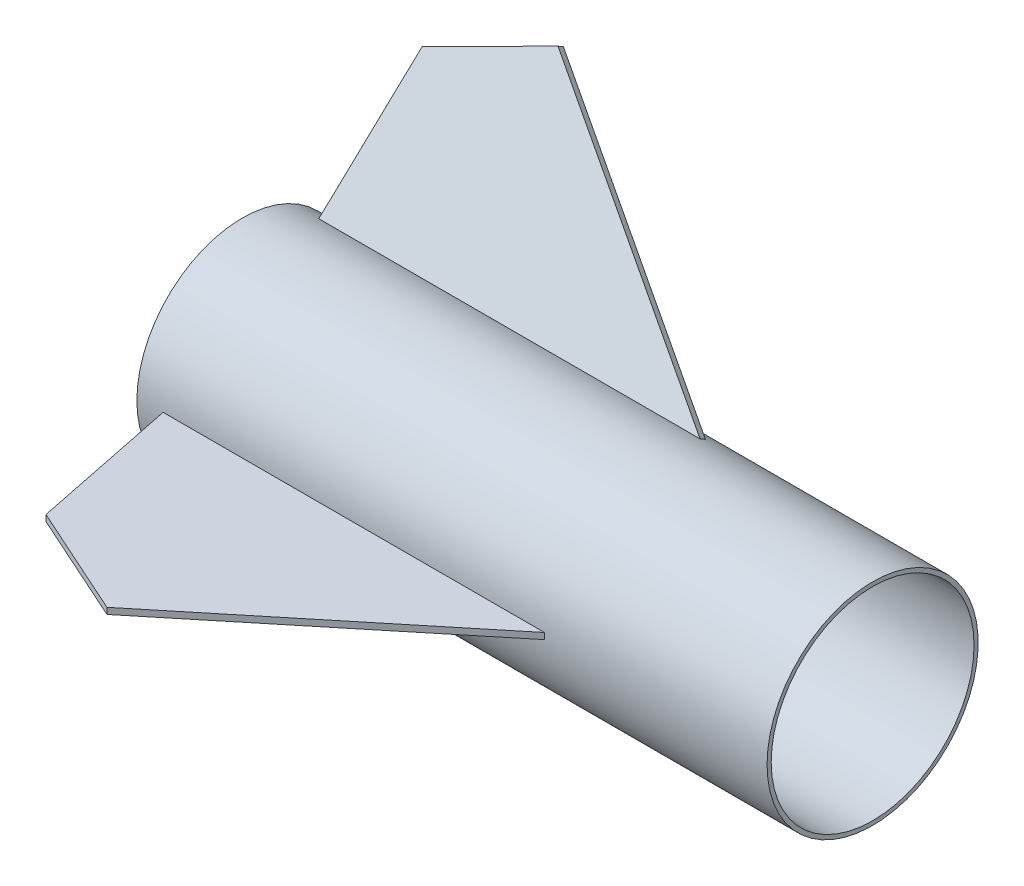
ISO-10303-21;
HEADER;
FILE_DESCRIPTION(('STEP AP214'),'2;1');
FILE_NAME('part.step','',(''),(''),'','','');
FILE_SCHEMA(('AUTOMOTIVE_DESIGN { 1 0 10303 214 1 1 1 1 }'));
ENDSEC;
DATA;
#1=APPLICATION_CONTEXT('core data for automotive mechanical design processes');
#2=APPLICATION_PROTOCOL_DEFINITION('international standard','automotive_design',2000,#1);
#3=PRODUCT_CONTEXT('',#1,'mechanical');
#4=PRODUCT('Part','Part','',(#3));
#5=PRODUCT_RELATED_PRODUCT_CATEGORY('part','',(#4));
#6=PRODUCT_DEFINITION_FORMATION('','',#4);
#7=PRODUCT_DEFINITION_CONTEXT('part definition',#1,'design');
#8=PRODUCT_DEFINITION('design','',#6,#7);
#9=PRODUCT_DEFINITION_SHAPE('','',#8);
#10=(LENGTH_UNIT() NAMED_UNIT(*) SI_UNIT(.MILLI.,.METRE.));
#11=(NAMED_UNIT(*) PLANE_ANGLE_UNIT() SI_UNIT($,.RADIAN.));
#12=(NAMED_UNIT(*) SI_UNIT($,.STERADIAN.) SOLID_ANGLE_UNIT());
#13=UNCERTAINTY_MEASURE_WITH_UNIT(LENGTH_MEASURE(1.E-05),#10,'distance_accuracy_value','');
#14=(GEOMETRIC_REPRESENTATION_CONTEXT(3) GLOBAL_UNCERTAINTY_ASSIGNED_CONTEXT((#13)) GLOBAL_UNIT_ASSIGNED_CONTEXT((#10,
#11,#12)) REPRESENTATION_CONTEXT('',''));
#15=CARTESIAN_POINT('',(0.,0.,0.));
#16=DIRECTION('',(0.,0.,1.));
#17=DIRECTION('',(1.,0.,0.));
#18=AXIS2_PLACEMENT_3D('',#15,#16,#17);
#19=CARTESIAN_POINT('',(27.1780000000002,-105.055787681961,-62.3860381056757));
#20=DIRECTION('',(-0.979901892234314,-0.172754771849313,-0.0997400140309911));
#21=DIRECTION('',(0.199480028061985,-0.848619931891362,-0.489950946117149));
#22=AXIS2_PLACEMENT_3D('',#19,#20,#21);
#23=PLANE('',#22);
#24=DIRECTION('',(0.,-0.499999999999992,0.866025403784443));
#25=VECTOR('',#24,1.);
#26=CARTESIAN_POINT('',(27.1780000000002,-105.055787681961,-62.3860381056757));
#27=LINE('',#26,#25);
#28=CARTESIAN_POINT('',(27.1780000000002,-105.055787681961,-62.3860381056757));
#29=VERTEX_POINT('',#28);
#30=CARTESIAN_POINT('',(27.1780000000002,-106.555787681961,-59.7879618943223));
#31=VERTEX_POINT('',#30);
#32=EDGE_CURVE('E53',#29,#31,#27,.T.);
#33=ORIENTED_EDGE('',*,*,#32,.T.);
#34=DIRECTION('',(0.199480028061985,-0.848619931891362,-0.489950946117149));
#35=VECTOR('',#34,1.);
#36=CARTESIAN_POINT('',(27.1780000000002,-106.555787681961,-59.7879618943223));
#37=LINE('',#36,#35);
#38=CARTESIAN_POINT('',(12.7000000000002,-44.9640609648109,-24.2279618943229));
#39=VERTEX_POINT('',#38);
#40=EDGE_CURVE('E90',#39,#31,#37,.T.);
#41=ORIENTED_EDGE('',*,*,#40,.F.);
#42=DIRECTION('',(0.,-0.499999999999992,0.866025403784443));
#43=VECTOR('',#42,1.);
#44=CARTESIAN_POINT('',(12.7000000000002,-43.464060964811,-26.8260381056763));
#45=LINE('',#44,#43);
#46=CARTESIAN_POINT('',(12.7000000000002,-43.464060964811,-26.8260381056763));
#47=VERTEX_POINT('',#46);
#48=EDGE_CURVE('E12',#47,#39,#45,.T.);
#49=ORIENTED_EDGE('',*,*,#48,.F.);
#50=DIRECTION('',(0.199480028061985,-0.848619931891362,-0.489950946117149));
#51=VECTOR('',#50,1.);
#52=CARTESIAN_POINT('',(27.1780000000002,-105.055787681961,-62.3860381056757));
#53=LINE('',#52,#51);
#54=EDGE_CURVE('E91',#47,#29,#53,.T.);
#55=ORIENTED_EDGE('',*,*,#54,.T.);
#56=EDGE_LOOP('',(#33,#41,#49,#55));
#57=FACE_BOUND('',#56,.T.);
#58=ADVANCED_FACE('F50',(#57),#23,.T.);
#59=CARTESIAN_POINT('',(12.7000000000002,-43.464060964811,-26.8260381056763));
#60=DIRECTION('',(0.,0.866025403784443,0.499999999999992));
#61=DIRECTION('',(-1.,0.,0.));
#62=AXIS2_PLACEMENT_3D('',#59,#60,#61);
#63=PLANE('',#62);
#64=ORIENTED_EDGE('',*,*,#48,.T.);
#65=DIRECTION('',(-1.,0.,0.));
#66=VECTOR('',#65,1.);
#67=CARTESIAN_POINT('',(12.7000000000002,-44.9640609648109,-24.2279618943229));
#68=LINE('',#67,#66);
#69=CARTESIAN_POINT('',(197.104,-44.9640609648109,-24.2279618943229));
#70=VERTEX_POINT('',#69);
#71=EDGE_CURVE('E107',#70,#39,#68,.T.);
#72=ORIENTED_EDGE('',*,*,#71,.F.);
#73=DIRECTION('',(0.,-0.499999999999992,0.866025403784443));
#74=VECTOR('',#73,1.);
#75=CARTESIAN_POINT('',(197.104,-43.464060964811,-26.8260381056762));
#76=LINE('',#75,#74);
#77=CARTESIAN_POINT('',(197.104,-43.464060964811,-26.8260381056762));
#78=VERTEX_POINT('',#77);
#79=EDGE_CURVE('E58',#78,#70,#76,.T.);
#80=ORIENTED_EDGE('',*,*,#79,.F.);
#81=DIRECTION('',(-1.,0.,0.));
#82=VECTOR('',#81,1.);
#83=CARTESIAN_POINT('',(12.7000000000002,-43.464060964811,-26.8260381056763));
#84=LINE('',#83,#82);
#85=EDGE_CURVE('E96',#78,#47,#84,.T.);
#86=ORIENTED_EDGE('',*,*,#85,.T.);
#87=EDGE_LOOP('',(#64,#72,#80,#86));
#88=FACE_BOUND('',#87,.T.);
#89=ADVANCED_FACE('F122',(#88),#63,.T.);
#90=CARTESIAN_POINT('',(197.104,-43.464060964811,-26.8260381056762));
#91=DIRECTION('',(0.633513736179013,-0.67007108544869,-0.386865721559978));
#92=DIRECTION('',(0.773731443119968,0.548638989177421,0.316756868089502));
#93=AXIS2_PLACEMENT_3D('',#90,#91,#92);
#94=PLANE('',#93);
#95=ORIENTED_EDGE('',*,*,#79,.T.);
#96=DIRECTION('',(0.773731443119968,0.548638989177421,0.316756868089501));
#97=VECTOR('',#96,1.);
#98=CARTESIAN_POINT('',(197.104,-44.9640609648109,-24.2279618943229));
#99=LINE('',#98,#97);
#100=CARTESIAN_POINT('',(80.7720000000002,-127.452980675279,-71.8529618943222));
#101=VERTEX_POINT('',#100);
#102=EDGE_CURVE('E103',#101,#70,#99,.T.);
#103=ORIENTED_EDGE('',*,*,#102,.F.);
#104=DIRECTION('',(0.,-0.499999999999992,0.866025403784443));
#105=VECTOR('',#104,1.);
#106=CARTESIAN_POINT('',(80.7720000000002,-125.952980675279,-74.4510381056755));
#107=LINE('',#106,#105);
#108=CARTESIAN_POINT('',(80.7720000000002,-125.952980675279,-74.4510381056755));
#109=VERTEX_POINT('',#108);
#110=EDGE_CURVE('E95',#109,#101,#107,.T.);
#111=ORIENTED_EDGE('',*,*,#110,.F.);
#112=DIRECTION('',(0.773731443119968,0.548638989177421,0.316756868089501));
#113=VECTOR('',#112,1.);
#114=CARTESIAN_POINT('',(197.104,-43.464060964811,-26.8260381056762));
#115=LINE('',#114,#113);
#116=EDGE_CURVE('E115',#109,#78,#115,.T.);
#117=ORIENTED_EDGE('',*,*,#116,.T.);
#118=EDGE_LOOP('',(#95,#103,#111,#117));
#119=FACE_BOUND('',#118,.T.);
#120=ADVANCED_FACE('F119',(#119),#94,.T.);
#121=CARTESIAN_POINT('',(80.7720000000002,-125.952980675279,-74.4510381056755));
#122=DIRECTION('',(-0.410544358325341,-0.78967714756439,-0.455920313719187));
#123=DIRECTION('',(0.911840627438388,-0.355541843690129,-0.205272179162667));
#124=AXIS2_PLACEMENT_3D('',#121,#122,#123);
#125=PLANE('',#124);
#126=ORIENTED_EDGE('',*,*,#110,.T.);
#127=DIRECTION('',(0.911840627438388,-0.355541843690129,-0.205272179162667));
#128=VECTOR('',#127,1.);
#129=CARTESIAN_POINT('',(80.7720000000002,-127.452980675279,-71.8529618943222));
#130=LINE('',#129,#128);
#131=EDGE_CURVE('E98',#31,#101,#130,.T.);
#132=ORIENTED_EDGE('',*,*,#131,.F.);
#133=ORIENTED_EDGE('',*,*,#32,.F.);
#134=DIRECTION('',(0.911840627438388,-0.355541843690129,-0.205272179162667));
#135=VECTOR('',#134,1.);
#136=CARTESIAN_POINT('',(80.7720000000002,-125.952980675279,-74.4510381056755));
#137=LINE('',#136,#135);
#138=EDGE_CURVE('E113',#29,#109,#137,.T.);
#139=ORIENTED_EDGE('',*,*,#138,.T.);
#140=EDGE_LOOP('',(#126,#132,#133,#139));
#141=FACE_BOUND('',#140,.T.);
#142=ADVANCED_FACE('F99',(#141),#125,.T.);
#143=CARTESIAN_POINT('',(0.,0.749999999999988,-1.29903810567666));
#144=DIRECTION('',(0.,0.499999999999992,-0.866025403784443));
#145=DIRECTION('',(0.,0.866025403784443,0.499999999999992));
#146=AXIS2_PLACEMENT_3D('',#143,#144,#145);
#147=PLANE('',#146);
#148=ORIENTED_EDGE('',*,*,#54,.F.);
#149=ORIENTED_EDGE('',*,*,#85,.F.);
#150=ORIENTED_EDGE('',*,*,#116,.F.);
#151=ORIENTED_EDGE('',*,*,#138,.F.);
#152=EDGE_LOOP('',(#148,#149,#150,#151));
#153=FACE_BOUND('',#152,.T.);
#154=ADVANCED_FACE('F124',(#153),#147,.T.);
#155=CARTESIAN_POINT('',(0.,-0.749999999999988,1.29903810567666));
#156=DIRECTION('',(0.,0.499999999999992,-0.866025403784443));
#157=DIRECTION('',(0.,0.866025403784443,0.499999999999992));
#158=AXIS2_PLACEMENT_3D('',#155,#156,#157);
#159=PLANE('',#158);
#160=ORIENTED_EDGE('',*,*,#40,.T.);
#161=ORIENTED_EDGE('',*,*,#131,.T.);
#162=ORIENTED_EDGE('',*,*,#102,.T.);
#163=ORIENTED_EDGE('',*,*,#71,.T.);
#164=EDGE_LOOP('',(#160,#161,#162,#163));
#165=FACE_BOUND('',#164,.T.);
#166=ADVANCED_FACE('F106',(#165),#159,.F.);
#167=CLOSED_SHELL('',(#58,#89,#120,#142,#154,#166));
#168=MANIFOLD_SOLID_BREP('B2',#167);
#169=CARTESIAN_POINT('',(27.1780000000002,106.55578768196,-59.7879618943238));
#170=DIRECTION('',(-0.979901892234314,0.172754771849312,-0.0997400140309935));
#171=DIRECTION('',(0.199480028061985,0.848619931891355,-0.489950946117161));
#172=AXIS2_PLACEMENT_3D('',#169,#170,#171);
#173=PLANE('',#172);
#174=DIRECTION('',(0.,-0.500000000000004,-0.866025403784436));
#175=VECTOR('',#174,1.);
#176=CARTESIAN_POINT('',(27.1780000000002,106.55578768196,-59.7879618943238));
#177=LINE('',#176,#175);
#178=CARTESIAN_POINT('',(27.1780000000002,106.55578768196,-59.7879618943238));
#179=VERTEX_POINT('',#178);
#180=CARTESIAN_POINT('',(27.1780000000002,105.05578768196,-62.3860381056771));
#181=VERTEX_POINT('',#180);
#182=EDGE_CURVE('E187',#179,#181,#177,.T.);
#183=ORIENTED_EDGE('',*,*,#182,.T.);
#184=DIRECTION('',(0.199480028061985,0.848619931891355,-0.489950946117161));
#185=VECTOR('',#184,1.);
#186=CARTESIAN_POINT('',(27.1780000000002,105.05578768196,-62.3860381056771));
#187=LINE('',#186,#185);
#188=CARTESIAN_POINT('',(12.7000000000002,43.4640609648106,-26.8260381056769));
#189=VERTEX_POINT('',#188);
#190=EDGE_CURVE('E224',#189,#181,#187,.T.);
#191=ORIENTED_EDGE('',*,*,#190,.F.);
#192=DIRECTION('',(0.,-0.500000000000004,-0.866025403784436));
#193=VECTOR('',#192,1.);
#194=CARTESIAN_POINT('',(12.7000000000002,44.9640609648106,-24.2279618943236));
#195=LINE('',#194,#193);
#196=CARTESIAN_POINT('',(12.7000000000002,44.9640609648106,-24.2279618943236));
#197=VERTEX_POINT('',#196);
#198=EDGE_CURVE('E48',#197,#189,#195,.T.);
#199=ORIENTED_EDGE('',*,*,#198,.F.);
#200=DIRECTION('',(0.199480028061985,0.848619931891355,-0.489950946117161));
#201=VECTOR('',#200,1.);
#202=CARTESIAN_POINT('',(27.1780000000002,106.55578768196,-59.7879618943238));
#203=LINE('',#202,#201);
#204=EDGE_CURVE('E225',#197,#179,#203,.T.);
#205=ORIENTED_EDGE('',*,*,#204,.T.);
#206=EDGE_LOOP('',(#183,#191,#199,#205));
#207=FACE_BOUND('',#206,.T.);
#208=ADVANCED_FACE('F184',(#207),#173,.T.);
#209=CARTESIAN_POINT('',(12.7000000000002,44.9640609648106,-24.2279618943236));
#210=DIRECTION('',(0.,-0.866025403784436,0.500000000000004));
#211=DIRECTION('',(-1.,0.,0.));
#212=AXIS2_PLACEMENT_3D('',#209,#210,#211);
#213=PLANE('',#212);
#214=ORIENTED_EDGE('',*,*,#198,.T.);
#215=DIRECTION('',(-1.,0.,0.));
#216=VECTOR('',#215,1.);
#217=CARTESIAN_POINT('',(12.7000000000002,43.4640609648106,-26.8260381056769));
#218=LINE('',#217,#216);
#219=CARTESIAN_POINT('',(197.104,43.4640609648106,-26.8260381056769));
#220=VERTEX_POINT('',#219);
#221=EDGE_CURVE('E241',#220,#189,#218,.T.);
#222=ORIENTED_EDGE('',*,*,#221,.F.);
#223=DIRECTION('',(0.,-0.500000000000004,-0.866025403784436));
#224=VECTOR('',#223,1.);
#225=CARTESIAN_POINT('',(197.104,44.9640609648106,-24.2279618943235));
#226=LINE('',#225,#224);
#227=CARTESIAN_POINT('',(197.104,44.9640609648106,-24.2279618943235));
#228=VERTEX_POINT('',#227);
#229=EDGE_CURVE('E192',#228,#220,#226,.T.);
#230=ORIENTED_EDGE('',*,*,#229,.F.);
#231=DIRECTION('',(-1.,0.,0.));
#232=VECTOR('',#231,1.);
#233=CARTESIAN_POINT('',(12.7000000000002,44.9640609648106,-24.2279618943236));
#234=LINE('',#233,#232);
#235=EDGE_CURVE('E230',#228,#197,#234,.T.);
#236=ORIENTED_EDGE('',*,*,#235,.T.);
#237=EDGE_LOOP('',(#214,#222,#230,#236));
#238=FACE_BOUND('',#237,.T.);
#239=ADVANCED_FACE('F256',(#238),#213,.T.);
#240=CARTESIAN_POINT('',(197.104,44.9640609648106,-24.2279618943235));
#241=DIRECTION('',(0.633513736179013,0.670071085448685,-0.386865721559987));
#242=DIRECTION('',(0.773731443119968,-0.548638989177417,0.316756868089509));
#243=AXIS2_PLACEMENT_3D('',#240,#241,#242);
#244=PLANE('',#243);
#245=ORIENTED_EDGE('',*,*,#229,.T.);
#246=DIRECTION('',(0.773731443119968,-0.548638989177417,0.316756868089509));
#247=VECTOR('',#246,1.);
#248=CARTESIAN_POINT('',(197.104,43.4640609648106,-26.8260381056769));
#249=LINE('',#248,#247);
#250=CARTESIAN_POINT('',(80.7720000000002,125.952980675278,-74.4510381056773));
#251=VERTEX_POINT('',#250);
#252=EDGE_CURVE('E237',#251,#220,#249,.T.);
#253=ORIENTED_EDGE('',*,*,#252,.F.);
#254=DIRECTION('',(0.,-0.500000000000004,-0.866025403784436));
#255=VECTOR('',#254,1.);
#256=CARTESIAN_POINT('',(80.7720000000002,127.452980675278,-71.852961894324));
#257=LINE('',#256,#255);
#258=CARTESIAN_POINT('',(80.7720000000002,127.452980675278,-71.852961894324));
#259=VERTEX_POINT('',#258);
#260=EDGE_CURVE('E229',#259,#251,#257,.T.);
#261=ORIENTED_EDGE('',*,*,#260,.F.);
#262=DIRECTION('',(0.773731443119968,-0.548638989177417,0.316756868089509));
#263=VECTOR('',#262,1.);
#264=CARTESIAN_POINT('',(197.104,44.9640609648106,-24.2279618943235));
#265=LINE('',#264,#263);
#266=EDGE_CURVE('E249',#259,#228,#265,.T.);
#267=ORIENTED_EDGE('',*,*,#266,.T.);
#268=EDGE_LOOP('',(#245,#253,#261,#267));
#269=FACE_BOUND('',#268,.T.);
#270=ADVANCED_FACE('F253',(#269),#244,.T.);
#271=CARTESIAN_POINT('',(80.7720000000002,127.452980675278,-71.852961894324));
#272=DIRECTION('',(-0.410544358325341,0.789677147564384,-0.455920313719198));
#273=DIRECTION('',(0.911840627438388,0.355541843690126,-0.205272179162672));
#274=AXIS2_PLACEMENT_3D('',#271,#272,#273);
#275=PLANE('',#274);
#276=ORIENTED_EDGE('',*,*,#260,.T.);
#277=DIRECTION('',(0.911840627438388,0.355541843690126,-0.205272179162672));
#278=VECTOR('',#277,1.);
#279=CARTESIAN_POINT('',(80.7720000000002,125.952980675278,-74.4510381056773));
#280=LINE('',#279,#278);
#281=EDGE_CURVE('E232',#181,#251,#280,.T.);
#282=ORIENTED_EDGE('',*,*,#281,.F.);
#283=ORIENTED_EDGE('',*,*,#182,.F.);
#284=DIRECTION('',(0.911840627438388,0.355541843690126,-0.205272179162672));
#285=VECTOR('',#284,1.);
#286=CARTESIAN_POINT('',(80.7720000000002,127.452980675278,-71.852961894324));
#287=LINE('',#286,#285);
#288=EDGE_CURVE('E247',#179,#259,#287,.T.);
#289=ORIENTED_EDGE('',*,*,#288,.T.);
#290=EDGE_LOOP('',(#276,#282,#283,#289));
#291=FACE_BOUND('',#290,.T.);
#292=ADVANCED_FACE('F233',(#291),#275,.T.);
#293=CARTESIAN_POINT('',(0.,0.750000000000006,1.29903810567665));
#294=DIRECTION('',(0.,0.500000000000004,0.866025403784436));
#295=DIRECTION('',(0.,-0.866025403784436,0.500000000000004));
#296=AXIS2_PLACEMENT_3D('',#293,#294,#295);
#297=PLANE('',#296);
#298=ORIENTED_EDGE('',*,*,#204,.F.);
#299=ORIENTED_EDGE('',*,*,#235,.F.);
#300=ORIENTED_EDGE('',*,*,#266,.F.);
#301=ORIENTED_EDGE('',*,*,#288,.F.);
#302=EDGE_LOOP('',(#298,#299,#300,#301));
#303=FACE_BOUND('',#302,.T.);
#304=ADVANCED_FACE('F258',(#303),#297,.T.);
#305=CARTESIAN_POINT('',(0.,-0.750000000000006,-1.29903810567665));
#306=DIRECTION('',(0.,0.500000000000004,0.866025403784436));
#307=DIRECTION('',(0.,-0.866025403784436,0.500000000000004));
#308=AXIS2_PLACEMENT_3D('',#305,#306,#307);
#309=PLANE('',#308);
#310=ORIENTED_EDGE('',*,*,#190,.T.);
#311=ORIENTED_EDGE('',*,*,#281,.T.);
#312=ORIENTED_EDGE('',*,*,#252,.T.);
#313=ORIENTED_EDGE('',*,*,#221,.T.);
#314=EDGE_LOOP('',(#310,#311,#312,#313));
#315=FACE_BOUND('',#314,.T.);
#316=ADVANCED_FACE('F240',(#315),#309,.F.);
#317=CLOSED_SHELL('',(#208,#239,#270,#292,#304,#316));
#318=MANIFOLD_SOLID_BREP('B6',#317);
#319=CARTESIAN_POINT('',(27.1780000000002,-1.5,122.174));
#320=DIRECTION('',(-0.979901892234314,0.,0.199480028061985));
#321=DIRECTION('',(0.199480028061985,0.,0.979901892234314));
#322=AXIS2_PLACEMENT_3D('',#319,#320,#321);
#323=PLANE('',#322);
#324=DIRECTION('',(0.,1.,0.));
#325=VECTOR('',#324,1.);
#326=CARTESIAN_POINT('',(27.1780000000002,-1.5,122.174));
#327=LINE('',#326,#325);
#328=CARTESIAN_POINT('',(27.1780000000002,-1.5,122.174));
#329=VERTEX_POINT('',#328);
#330=CARTESIAN_POINT('',(27.1780000000002,1.5,122.174));
#331=VERTEX_POINT('',#330);
#332=EDGE_CURVE('E318',#329,#331,#327,.T.);
#333=ORIENTED_EDGE('',*,*,#332,.T.);
#334=DIRECTION('',(0.199480028061985,0.,0.979901892234314));
#335=VECTOR('',#334,1.);
#336=CARTESIAN_POINT('',(27.1780000000002,1.5,122.174));
#337=LINE('',#336,#335);
#338=CARTESIAN_POINT('',(12.7000000000002,1.5,51.054));
#339=VERTEX_POINT('',#338);
#340=EDGE_CURVE('E355',#339,#331,#337,.T.);
#341=ORIENTED_EDGE('',*,*,#340,.F.);
#342=DIRECTION('',(0.,1.,0.));
#343=VECTOR('',#342,1.);
#344=CARTESIAN_POINT('',(12.7000000000002,-1.5,51.054));
#345=LINE('',#344,#343);
#346=CARTESIAN_POINT('',(12.7000000000002,-1.5,51.054));
#347=VERTEX_POINT('',#346);
#348=EDGE_CURVE('E182',#347,#339,#345,.T.);
#349=ORIENTED_EDGE('',*,*,#348,.F.);
#350=DIRECTION('',(0.199480028061985,0.,0.979901892234314));
#351=VECTOR('',#350,1.);
#352=CARTESIAN_POINT('',(27.1780000000002,-1.5,122.174));
#353=LINE('',#352,#351);
#354=EDGE_CURVE('E356',#347,#329,#353,.T.);
#355=ORIENTED_EDGE('',*,*,#354,.T.);
#356=EDGE_LOOP('',(#333,#341,#349,#355));
#357=FACE_BOUND('',#356,.T.);
#358=ADVANCED_FACE('F315',(#357),#323,.T.);
#359=CARTESIAN_POINT('',(12.7000000000002,-1.5,51.054));
#360=DIRECTION('',(0.,0.,-1.));
#361=DIRECTION('',(-1.,0.,0.));
#362=AXIS2_PLACEMENT_3D('',#359,#360,#361);
#363=PLANE('',#362);
#364=ORIENTED_EDGE('',*,*,#348,.T.);
#365=DIRECTION('',(-1.,0.,0.));
#366=VECTOR('',#365,1.);
#367=CARTESIAN_POINT('',(12.7000000000002,1.5,51.054));
#368=LINE('',#367,#366);
#369=CARTESIAN_POINT('',(197.104,1.5,51.054));
#370=VERTEX_POINT('',#369);
#371=EDGE_CURVE('E372',#370,#339,#368,.T.);
#372=ORIENTED_EDGE('',*,*,#371,.F.);
#373=DIRECTION('',(0.,1.,0.));
#374=VECTOR('',#373,1.);
#375=CARTESIAN_POINT('',(197.104,-1.5,51.054));
#376=LINE('',#375,#374);
#377=CARTESIAN_POINT('',(197.104,-1.5,51.054));
#378=VERTEX_POINT('',#377);
#379=EDGE_CURVE('E323',#378,#370,#376,.T.);
#380=ORIENTED_EDGE('',*,*,#379,.F.);
#381=DIRECTION('',(-1.,0.,0.));
#382=VECTOR('',#381,1.);
#383=CARTESIAN_POINT('',(12.7000000000002,-1.5,51.054));
#384=LINE('',#383,#382);
#385=EDGE_CURVE('E361',#378,#347,#384,.T.);
#386=ORIENTED_EDGE('',*,*,#385,.T.);
#387=EDGE_LOOP('',(#364,#372,#380,#386));
#388=FACE_BOUND('',#387,.T.);
#389=ADVANCED_FACE('F387',(#388),#363,.T.);
#390=CARTESIAN_POINT('',(197.104,-1.5,51.054));
#391=DIRECTION('',(0.633513736179013,0.,0.773731443119968));
#392=DIRECTION('',(0.773731443119968,0.,-0.633513736179013));
#393=AXIS2_PLACEMENT_3D('',#390,#391,#392);
#394=PLANE('',#393);
#395=ORIENTED_EDGE('',*,*,#379,.T.);
#396=DIRECTION('',(0.773731443119968,0.,-0.633513736179013));
#397=VECTOR('',#396,1.);
#398=CARTESIAN_POINT('',(197.104,1.5,51.054));
#399=LINE('',#398,#397);
#400=CARTESIAN_POINT('',(80.7720000000002,1.5,146.304));
#401=VERTEX_POINT('',#400);
#402=EDGE_CURVE('E368',#401,#370,#399,.T.);
#403=ORIENTED_EDGE('',*,*,#402,.F.);
#404=DIRECTION('',(0.,1.,0.));
#405=VECTOR('',#404,1.);
#406=CARTESIAN_POINT('',(80.7720000000002,-1.5,146.304));
#407=LINE('',#406,#405);
#408=CARTESIAN_POINT('',(80.7720000000002,-1.5,146.304));
#409=VERTEX_POINT('',#408);
#410=EDGE_CURVE('E360',#409,#401,#407,.T.);
#411=ORIENTED_EDGE('',*,*,#410,.F.);
#412=DIRECTION('',(0.773731443119968,0.,-0.633513736179013));
#413=VECTOR('',#412,1.);
#414=CARTESIAN_POINT('',(197.104,-1.5,51.054));
#415=LINE('',#414,#413);
#416=EDGE_CURVE('E380',#409,#378,#415,.T.);
#417=ORIENTED_EDGE('',*,*,#416,.T.);
#418=EDGE_LOOP('',(#395,#403,#411,#417));
#419=FACE_BOUND('',#418,.T.);
#420=ADVANCED_FACE('F384',(#419),#394,.T.);
#421=CARTESIAN_POINT('',(80.7720000000002,-1.5,146.304));
#422=DIRECTION('',(-0.410544358325341,0.,0.911840627438388));
#423=DIRECTION('',(0.911840627438388,0.,0.410544358325341));
#424=AXIS2_PLACEMENT_3D('',#421,#422,#423);
#425=PLANE('',#424);
#426=ORIENTED_EDGE('',*,*,#410,.T.);
#427=DIRECTION('',(0.911840627438388,0.,0.410544358325341));
#428=VECTOR('',#427,1.);
#429=CARTESIAN_POINT('',(80.7720000000002,1.5,146.304));
#430=LINE('',#429,#428);
#431=EDGE_CURVE('E363',#331,#401,#430,.T.);
#432=ORIENTED_EDGE('',*,*,#431,.F.);
#433=ORIENTED_EDGE('',*,*,#332,.F.);
#434=DIRECTION('',(0.911840627438388,0.,0.410544358325341));
#435=VECTOR('',#434,1.);
#436=CARTESIAN_POINT('',(80.7720000000002,-1.5,146.304));
#437=LINE('',#436,#435);
#438=EDGE_CURVE('E378',#329,#409,#437,.T.);
#439=ORIENTED_EDGE('',*,*,#438,.T.);
#440=EDGE_LOOP('',(#426,#432,#433,#439));
#441=FACE_BOUND('',#440,.T.);
#442=ADVANCED_FACE('F364',(#441),#425,.T.);
#443=CARTESIAN_POINT('',(0.,-1.5,0.));
#444=DIRECTION('',(0.,-1.,0.));
#445=DIRECTION('',(0.,0.,-1.));
#446=AXIS2_PLACEMENT_3D('',#443,#444,#445);
#447=PLANE('',#446);
#448=ORIENTED_EDGE('',*,*,#354,.F.);
#449=ORIENTED_EDGE('',*,*,#385,.F.);
#450=ORIENTED_EDGE('',*,*,#416,.F.);
#451=ORIENTED_EDGE('',*,*,#438,.F.);
#452=EDGE_LOOP('',(#448,#449,#450,#451));
#453=FACE_BOUND('',#452,.T.);
#454=ADVANCED_FACE('F389',(#453),#447,.T.);
#455=CARTESIAN_POINT('',(0.,1.5,0.));
#456=DIRECTION('',(0.,-1.,0.));
#457=DIRECTION('',(0.,0.,-1.));
#458=AXIS2_PLACEMENT_3D('',#455,#456,#457);
#459=PLANE('',#458);
#460=ORIENTED_EDGE('',*,*,#340,.T.);
#461=ORIENTED_EDGE('',*,*,#431,.T.);
#462=ORIENTED_EDGE('',*,*,#402,.T.);
#463=ORIENTED_EDGE('',*,*,#371,.T.);
#464=EDGE_LOOP('',(#460,#461,#462,#463));
#465=FACE_BOUND('',#464,.T.);
#466=ADVANCED_FACE('F371',(#465),#459,.F.);
#467=CLOSED_SHELL('',(#358,#389,#420,#442,#454,#466));
#468=MANIFOLD_SOLID_BREP('B42',#467);
#469=CARTESIAN_POINT('',(304.8,0.,0.));
#470=DIRECTION('',(1.,0.,0.));
#471=DIRECTION('',(0.,0.,-1.));
#472=AXIS2_PLACEMENT_3D('',#469,#470,#471);
#473=PLANE('',#472);
#474=CARTESIAN_POINT('',(304.8,0.,0.));
#475=DIRECTION('',(1.,0.,0.));
#476=DIRECTION('',(0.,0.,-1.));
#477=AXIS2_PLACEMENT_3D('',#474,#475,#476);
#478=CIRCLE('',#477,51.054);
#479=CARTESIAN_POINT('',(304.8,0.,51.054));
#480=VERTEX_POINT('',#479);
#481=EDGE_CURVE('E314',#480,#480,#478,.T.);
#482=ORIENTED_EDGE('',*,*,#481,.T.);
#483=EDGE_LOOP('',(#482));
#484=FACE_BOUND('',#483,.T.);
#485=CARTESIAN_POINT('',(304.8,0.,0.));
#486=DIRECTION('',(1.,0.,0.));
#487=DIRECTION('',(0.,0.,-1.));
#488=AXIS2_PLACEMENT_3D('',#485,#486,#487);
#489=CIRCLE('',#488,49.0601);
#490=CARTESIAN_POINT('',(304.8,0.,49.0601));
#491=VERTEX_POINT('',#490);
#492=EDGE_CURVE('E450',#491,#491,#489,.T.);
#493=ORIENTED_EDGE('',*,*,#492,.F.);
#494=EDGE_LOOP('',(#493));
#495=FACE_BOUND('',#494,.T.);
#496=ADVANCED_FACE('F439',(#484,#495),#473,.T.);
#497=CARTESIAN_POINT('',(0.,0.,0.));
#498=DIRECTION('',(1.,0.,0.));
#499=DIRECTION('',(0.,0.,-1.));
#500=AXIS2_PLACEMENT_3D('',#497,#498,#499);
#501=PLANE('',#500);
#502=CARTESIAN_POINT('',(0.,0.,0.));
#503=DIRECTION('',(1.,0.,0.));
#504=DIRECTION('',(0.,0.,-1.));
#505=AXIS2_PLACEMENT_3D('',#502,#503,#504);
#506=CIRCLE('',#505,51.054);
#507=CARTESIAN_POINT('',(0.,0.,51.054));
#508=VERTEX_POINT('',#507);
#509=EDGE_CURVE('E443',#508,#508,#506,.T.);
#510=ORIENTED_EDGE('',*,*,#509,.F.);
#511=EDGE_LOOP('',(#510));
#512=FACE_BOUND('',#511,.T.);
#513=CARTESIAN_POINT('',(0.,0.,0.));
#514=DIRECTION('',(1.,0.,0.));
#515=DIRECTION('',(0.,0.,-1.));
#516=AXIS2_PLACEMENT_3D('',#513,#514,#515);
#517=CIRCLE('',#516,49.0601);
#518=CARTESIAN_POINT('',(0.,0.,49.0601));
#519=VERTEX_POINT('',#518);
#520=EDGE_CURVE('E452',#519,#519,#517,.T.);
#521=ORIENTED_EDGE('',*,*,#520,.T.);
#522=EDGE_LOOP('',(#521));
#523=FACE_BOUND('',#522,.T.);
#524=ADVANCED_FACE('F462',(#512,#523),#501,.F.);
#525=CARTESIAN_POINT('',(304.8,0.,0.));
#526=DIRECTION('',(-1.,0.,0.));
#527=DIRECTION('',(0.,0.,1.));
#528=AXIS2_PLACEMENT_3D('',#525,#526,#527);
#529=CYLINDRICAL_SURFACE('',#528,51.054);
#530=CARTESIAN_POINT('',(304.8,0.,51.054));
#531=CARTESIAN_POINT('',(301.625,0.,51.054));
#532=CARTESIAN_POINT('',(298.45,0.,51.054));
#533=CARTESIAN_POINT('',(292.1,0.,51.054));
#534=CARTESIAN_POINT('',(288.925,0.,51.054));
#535=CARTESIAN_POINT('',(282.575,0.,51.054));
#536=CARTESIAN_POINT('',(279.4,0.,51.054));
#537=CARTESIAN_POINT('',(273.05,0.,51.054));
#538=CARTESIAN_POINT('',(269.875,0.,51.054));
#539=CARTESIAN_POINT('',(263.525,0.,51.054));
#540=CARTESIAN_POINT('',(260.35,0.,51.054));
#541=CARTESIAN_POINT('',(254.,0.,51.054));
#542=CARTESIAN_POINT('',(250.825,0.,51.054));
#543=CARTESIAN_POINT('',(244.475,0.,51.054));
#544=CARTESIAN_POINT('',(241.3,0.,51.054));
#545=CARTESIAN_POINT('',(234.95,0.,51.054));
#546=CARTESIAN_POINT('',(231.775,0.,51.054));
#547=CARTESIAN_POINT('',(225.425,0.,51.054));
#548=CARTESIAN_POINT('',(222.25,0.,51.054));
#549=CARTESIAN_POINT('',(215.9,0.,51.054));
#550=CARTESIAN_POINT('',(212.725,0.,51.054));
#551=CARTESIAN_POINT('',(206.375,0.,51.054));
#552=CARTESIAN_POINT('',(203.2,0.,51.054));
#553=CARTESIAN_POINT('',(196.85,0.,51.054));
#554=CARTESIAN_POINT('',(193.675,0.,51.054));
#555=CARTESIAN_POINT('',(187.325,0.,51.054));
#556=CARTESIAN_POINT('',(184.15,0.,51.054));
#557=CARTESIAN_POINT('',(177.8,0.,51.054));
#558=CARTESIAN_POINT('',(174.625,0.,51.054));
#559=CARTESIAN_POINT('',(168.275,0.,51.054));
#560=CARTESIAN_POINT('',(165.1,0.,51.054));
#561=CARTESIAN_POINT('',(158.75,0.,51.054));
#562=CARTESIAN_POINT('',(155.575,0.,51.054));
#563=CARTESIAN_POINT('',(149.225,0.,51.054));
#564=CARTESIAN_POINT('',(146.05,0.,51.054));
#565=CARTESIAN_POINT('',(139.7,0.,51.054));
#566=CARTESIAN_POINT('',(136.525,0.,51.054));
#567=CARTESIAN_POINT('',(130.175,0.,51.054));
#568=CARTESIAN_POINT('',(127.,0.,51.054));
#569=CARTESIAN_POINT('',(120.65,0.,51.054));
#570=CARTESIAN_POINT('',(117.475,0.,51.054));
#571=CARTESIAN_POINT('',(111.125,0.,51.054));
#572=CARTESIAN_POINT('',(107.95,0.,51.054));
#573=CARTESIAN_POINT('',(101.6,0.,51.054));
#574=CARTESIAN_POINT('',(98.425,0.,51.054));
#575=CARTESIAN_POINT('',(92.075,0.,51.054));
#576=CARTESIAN_POINT('',(88.9,0.,51.054));
#577=CARTESIAN_POINT('',(82.55,0.,51.054));
#578=CARTESIAN_POINT('',(79.375,0.,51.054));
#579=CARTESIAN_POINT('',(73.025,0.,51.054));
#580=CARTESIAN_POINT('',(69.85,0.,51.054));
#581=CARTESIAN_POINT('',(63.5,0.,51.054));
#582=CARTESIAN_POINT('',(60.325,0.,51.054));
#583=CARTESIAN_POINT('',(53.975,0.,51.054));
#584=CARTESIAN_POINT('',(50.8,0.,51.054));
#585=CARTESIAN_POINT('',(44.45,0.,51.054));
#586=CARTESIAN_POINT('',(41.275,0.,51.054));
#587=CARTESIAN_POINT('',(34.925,0.,51.054));
#588=CARTESIAN_POINT('',(31.75,0.,51.054));
#589=CARTESIAN_POINT('',(25.4,0.,51.054));
#590=CARTESIAN_POINT('',(22.225,0.,51.054));
#591=CARTESIAN_POINT('',(15.875,0.,51.054));
#592=CARTESIAN_POINT('',(12.7,0.,51.054));
#593=CARTESIAN_POINT('',(6.35,0.,51.054));
#594=CARTESIAN_POINT('',(3.175,0.,51.054));
#595=CARTESIAN_POINT('',(0.,0.,51.054));
#596=B_SPLINE_CURVE_WITH_KNOTS('',3,(#530,#531,#532,#533,#534,#535,#536,#537,#538,#539,#540,
#541,#542,#543,#544,#545,#546,#547,#548,#549,#550,#551,#552,#553,#554,#555,#556,#557,#558,#559,
#560,#561,#562,#563,#564,#565,#566,#567,#568,#569,#570,#571,#572,#573,#574,#575,#576,#577,#578,
#579,#580,#581,#582,#583,#584,#585,#586,#587,#588,#589,#590,#591,#592,#593,#594,#595),
.UNSPECIFIED.,.F.,.F.,(4,2,2,2,2,2,2,2,2,2,2,2,2,2,2,2,2,2,2,2,2,2,2,2,2,2,2,2,2,2,2,2,4),(0.,
9.52499999999995,19.05,28.575,38.1,47.625,57.15,66.675,76.2,85.725,95.2499999999999,104.775,
114.3,123.825,133.35,142.875,152.4,161.925,171.45,180.975,190.5,200.025,209.55,219.075,228.6,
238.125,247.65,257.175,266.7,276.225,285.75,295.275,304.8),.UNSPECIFIED.);
#597=EDGE_CURVE('BSEAM441',#480,#508,#596,.T.);
#598=ORIENTED_EDGE('',*,*,#481,.F.);
#599=ORIENTED_EDGE('',*,*,#509,.T.);
#600=ORIENTED_EDGE('',*,*,#597,.T.);
#601=ORIENTED_EDGE('',*,*,#597,.F.);
#602=EDGE_LOOP('',(#598,#600,#599,#601));
#603=FACE_BOUND('',#602,.T.);
#604=ADVANCED_FACE('F441',(#603),#529,.T.);
#605=CARTESIAN_POINT('',(304.8,0.,0.));
#606=DIRECTION('',(-1.,0.,0.));
#607=DIRECTION('',(0.,0.,1.));
#608=AXIS2_PLACEMENT_3D('',#605,#606,#607);
#609=CYLINDRICAL_SURFACE('',#608,49.0601);
#610=CARTESIAN_POINT('',(304.8,0.,49.0601));
#611=CARTESIAN_POINT('',(301.625,0.,49.0601));
#612=CARTESIAN_POINT('',(298.45,0.,49.0601));
#613=CARTESIAN_POINT('',(292.1,0.,49.0601));
#614=CARTESIAN_POINT('',(288.925,0.,49.0601));
#615=CARTESIAN_POINT('',(282.575,0.,49.0601));
#616=CARTESIAN_POINT('',(279.4,0.,49.0601));
#617=CARTESIAN_POINT('',(273.05,0.,49.0601));
#618=CARTESIAN_POINT('',(269.875,0.,49.0601));
#619=CARTESIAN_POINT('',(263.525,0.,49.0601));
#620=CARTESIAN_POINT('',(260.35,0.,49.0601));
#621=CARTESIAN_POINT('',(254.,0.,49.0601));
#622=CARTESIAN_POINT('',(250.825,0.,49.0601));
#623=CARTESIAN_POINT('',(244.475,0.,49.0601));
#624=CARTESIAN_POINT('',(241.3,0.,49.0601));
#625=CARTESIAN_POINT('',(234.95,0.,49.0601));
#626=CARTESIAN_POINT('',(231.775,0.,49.0601));
#627=CARTESIAN_POINT('',(225.425,0.,49.0601));
#628=CARTESIAN_POINT('',(222.25,0.,49.0601));
#629=CARTESIAN_POINT('',(215.9,0.,49.0601));
#630=CARTESIAN_POINT('',(212.725,0.,49.0601));
#631=CARTESIAN_POINT('',(206.375,0.,49.0601));
#632=CARTESIAN_POINT('',(203.2,0.,49.0601));
#633=CARTESIAN_POINT('',(196.85,0.,49.0601));
#634=CARTESIAN_POINT('',(193.675,0.,49.0601));
#635=CARTESIAN_POINT('',(187.325,0.,49.0601));
#636=CARTESIAN_POINT('',(184.15,0.,49.0601));
#637=CARTESIAN_POINT('',(177.8,0.,49.0601));
#638=CARTESIAN_POINT('',(174.625,0.,49.0601));
#639=CARTESIAN_POINT('',(168.275,0.,49.0601));
#640=CARTESIAN_POINT('',(165.1,0.,49.0601));
#641=CARTESIAN_POINT('',(158.75,0.,49.0601));
#642=CARTESIAN_POINT('',(155.575,0.,49.0601));
#643=CARTESIAN_POINT('',(149.225,0.,49.0601));
#644=CARTESIAN_POINT('',(146.05,0.,49.0601));
#645=CARTESIAN_POINT('',(139.7,0.,49.0601));
#646=CARTESIAN_POINT('',(136.525,0.,49.0601));
#647=CARTESIAN_POINT('',(130.175,0.,49.0601));
#648=CARTESIAN_POINT('',(127.,0.,49.0601));
#649=CARTESIAN_POINT('',(120.65,0.,49.0601));
#650=CARTESIAN_POINT('',(117.475,0.,49.0601));
#651=CARTESIAN_POINT('',(111.125,0.,49.0601));
#652=CARTESIAN_POINT('',(107.95,0.,49.0601));
#653=CARTESIAN_POINT('',(101.6,0.,49.0601));
#654=CARTESIAN_POINT('',(98.425,0.,49.0601));
#655=CARTESIAN_POINT('',(92.075,0.,49.0601));
#656=CARTESIAN_POINT('',(88.9,0.,49.0601));
#657=CARTESIAN_POINT('',(82.55,0.,49.0601));
#658=CARTESIAN_POINT('',(79.375,0.,49.0601));
#659=CARTESIAN_POINT('',(73.025,0.,49.0601));
#660=CARTESIAN_POINT('',(69.85,0.,49.0601));
#661=CARTESIAN_POINT('',(63.5,0.,49.0601));
#662=CARTESIAN_POINT('',(60.325,0.,49.0601));
#663=CARTESIAN_POINT('',(53.975,0.,49.0601));
#664=CARTESIAN_POINT('',(50.8,0.,49.0601));
#665=CARTESIAN_POINT('',(44.45,0.,49.0601));
#666=CARTESIAN_POINT('',(41.275,0.,49.0601));
#667=CARTESIAN_POINT('',(34.925,0.,49.0601));
#668=CARTESIAN_POINT('',(31.75,0.,49.0601));
#669=CARTESIAN_POINT('',(25.4,0.,49.0601));
#670=CARTESIAN_POINT('',(22.225,0.,49.0601));
#671=CARTESIAN_POINT('',(15.875,0.,49.0601));
#672=CARTESIAN_POINT('',(12.7,0.,49.0601));
#673=CARTESIAN_POINT('',(6.35,0.,49.0601));
#674=CARTESIAN_POINT('',(3.175,0.,49.0601));
#675=CARTESIAN_POINT('',(0.,0.,49.0601));
#676=B_SPLINE_CURVE_WITH_KNOTS('',3,(#610,#611,#612,#613,#614,#615,#616,#617,#618,#619,#620,
#621,#622,#623,#624,#625,#626,#627,#628,#629,#630,#631,#632,#633,#634,#635,#636,#637,#638,#639,
#640,#641,#642,#643,#644,#645,#646,#647,#648,#649,#650,#651,#652,#653,#654,#655,#656,#657,#658,
#659,#660,#661,#662,#663,#664,#665,#666,#667,#668,#669,#670,#671,#672,#673,#674,#675),
.UNSPECIFIED.,.F.,.F.,(4,2,2,2,2,2,2,2,2,2,2,2,2,2,2,2,2,2,2,2,2,2,2,2,2,2,2,2,2,2,2,2,4),(0.,
9.52500000000001,19.05,28.575,38.1,47.625,57.15,66.675,76.2,85.7250000000001,95.2500000000001,
104.775,114.3,123.825,133.35,142.875,152.4,161.925,171.45,180.975,190.5,200.025,209.55,219.075,
228.6,238.125,247.65,257.175,266.7,276.225,285.75,295.275,304.8),.UNSPECIFIED.);
#677=EDGE_CURVE('BSEAM458',#491,#519,#676,.T.);
#678=ORIENTED_EDGE('',*,*,#492,.T.);
#679=ORIENTED_EDGE('',*,*,#520,.F.);
#680=ORIENTED_EDGE('',*,*,#677,.T.);
#681=ORIENTED_EDGE('',*,*,#677,.F.);
#682=EDGE_LOOP('',(#678,#680,#679,#681));
#683=FACE_BOUND('',#682,.T.);
#684=ADVANCED_FACE('F458',(#683),#609,.F.);
#685=CLOSED_SHELL('',(#496,#524,#604,#684));
#686=MANIFOLD_SOLID_BREP('B176',#685);
#687=ADVANCED_BREP_SHAPE_REPRESENTATION('',(#18,#168,#318,#468,#686),#14);
#688=SHAPE_DEFINITION_REPRESENTATION(#9,#687);
ENDSEC;
END-ISO-10303-21;
